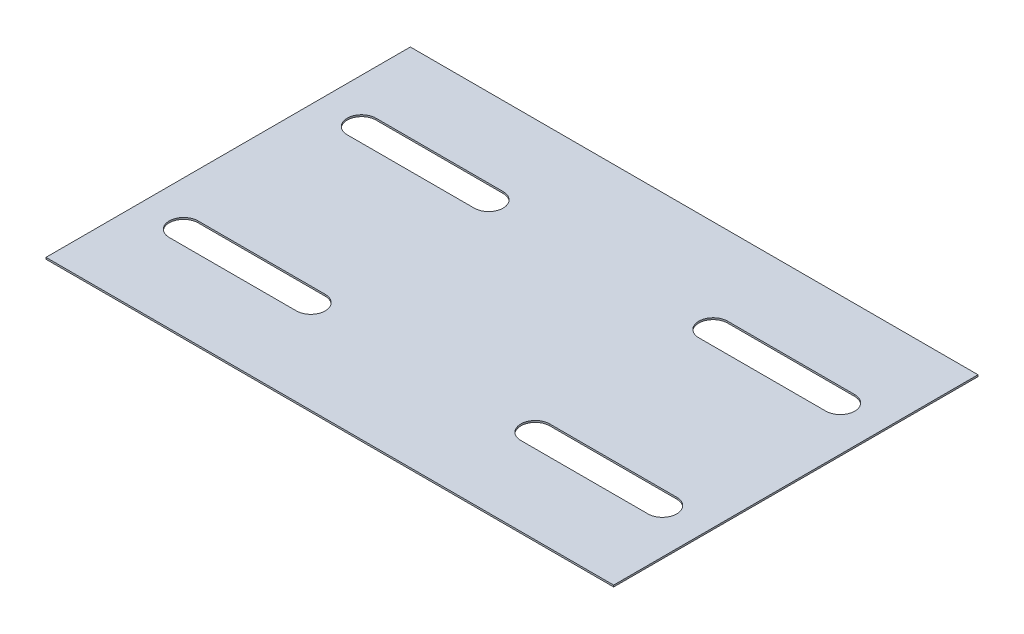
ISO-10303-21;
HEADER;
FILE_DESCRIPTION(('STEP AP214'),'2;1');
FILE_NAME('part.step','',(''),(''),'','','');
FILE_SCHEMA(('AUTOMOTIVE_DESIGN { 1 0 10303 214 1 1 1 1 }'));
ENDSEC;
DATA;
#1=APPLICATION_CONTEXT('core data for automotive mechanical design processes');
#2=APPLICATION_PROTOCOL_DEFINITION('international standard','automotive_design',2000,#1);
#3=PRODUCT_CONTEXT('',#1,'mechanical');
#4=PRODUCT('Part','Part','',(#3));
#5=PRODUCT_RELATED_PRODUCT_CATEGORY('part','',(#4));
#6=PRODUCT_DEFINITION_FORMATION('','',#4);
#7=PRODUCT_DEFINITION_CONTEXT('part definition',#1,'design');
#8=PRODUCT_DEFINITION('design','',#6,#7);
#9=PRODUCT_DEFINITION_SHAPE('','',#8);
#10=(LENGTH_UNIT() NAMED_UNIT(*) SI_UNIT(.MILLI.,.METRE.));
#11=(NAMED_UNIT(*) PLANE_ANGLE_UNIT() SI_UNIT($,.RADIAN.));
#12=(NAMED_UNIT(*) SI_UNIT($,.STERADIAN.) SOLID_ANGLE_UNIT());
#13=UNCERTAINTY_MEASURE_WITH_UNIT(LENGTH_MEASURE(1.E-05),#10,'distance_accuracy_value','');
#14=(GEOMETRIC_REPRESENTATION_CONTEXT(3) GLOBAL_UNCERTAINTY_ASSIGNED_CONTEXT((#13)) GLOBAL_UNIT_ASSIGNED_CONTEXT((#10,
#11,#12)) REPRESENTATION_CONTEXT('',''));
#15=CARTESIAN_POINT('',(0.,0.,0.));
#16=DIRECTION('',(0.,0.,1.));
#17=DIRECTION('',(1.,0.,0.));
#18=AXIS2_PLACEMENT_3D('',#15,#16,#17);
#19=CARTESIAN_POINT('',(28.25,0.2,10.5));
#20=DIRECTION('',(0.,-1.,0.));
#21=DIRECTION('',(0.,0.,-1.));
#22=AXIS2_PLACEMENT_3D('',#19,#20,#21);
#23=CYLINDRICAL_SURFACE('',#22,1.7);
#24=DIRECTION('',(0.,1.,0.));
#25=VECTOR('',#24,1.);
#26=CARTESIAN_POINT('',(28.25,0.2,8.8));
#27=LINE('',#26,#25);
#28=CARTESIAN_POINT('',(28.25,0.,8.8));
#29=VERTEX_POINT('',#28);
#30=CARTESIAN_POINT('',(28.25,0.2,8.8));
#31=VERTEX_POINT('',#30);
#32=EDGE_CURVE('E11',#29,#31,#27,.T.);
#33=ORIENTED_EDGE('',*,*,#32,.F.);
#34=CARTESIAN_POINT('',(28.25,0.,10.5));
#35=DIRECTION('',(0.,1.,0.));
#36=DIRECTION('',(0.,0.,1.));
#37=AXIS2_PLACEMENT_3D('',#34,#35,#36);
#38=CIRCLE('',#37,1.7);
#39=CARTESIAN_POINT('',(28.25,0.,12.2));
#40=VERTEX_POINT('',#39);
#41=EDGE_CURVE('E156',#40,#29,#38,.T.);
#42=ORIENTED_EDGE('',*,*,#41,.F.);
#43=DIRECTION('',(0.,1.,0.));
#44=VECTOR('',#43,1.);
#45=CARTESIAN_POINT('',(28.25,0.2,12.2));
#46=LINE('',#45,#44);
#47=CARTESIAN_POINT('',(28.25,0.2,12.2));
#48=VERTEX_POINT('',#47);
#49=EDGE_CURVE('E62',#40,#48,#46,.T.);
#50=ORIENTED_EDGE('',*,*,#49,.T.);
#51=CARTESIAN_POINT('',(28.25,0.2,10.5));
#52=DIRECTION('',(0.,1.,0.));
#53=DIRECTION('',(0.,0.,-1.));
#54=AXIS2_PLACEMENT_3D('',#51,#52,#53);
#55=CIRCLE('',#54,1.7);
#56=EDGE_CURVE('E250',#48,#31,#55,.T.);
#57=ORIENTED_EDGE('',*,*,#56,.T.);
#58=EDGE_LOOP('',(#33,#42,#50,#57));
#59=FACE_BOUND('',#58,.T.);
#60=ADVANCED_FACE('F51',(#59),#23,.F.);
#61=CARTESIAN_POINT('',(13.25,0.2,12.2));
#62=DIRECTION('',(0.,0.,-1.));
#63=DIRECTION('',(1.,0.,0.));
#64=AXIS2_PLACEMENT_3D('',#61,#62,#63);
#65=PLANE('',#64);
#66=ORIENTED_EDGE('',*,*,#49,.F.);
#67=DIRECTION('',(1.,0.,0.));
#68=VECTOR('',#67,1.);
#69=CARTESIAN_POINT('',(0.,0.,12.2));
#70=LINE('',#69,#68);
#71=CARTESIAN_POINT('',(13.25,0.,12.2));
#72=VERTEX_POINT('',#71);
#73=EDGE_CURVE('E174',#72,#40,#70,.T.);
#74=ORIENTED_EDGE('',*,*,#73,.F.);
#75=DIRECTION('',(0.,1.,0.));
#76=VECTOR('',#75,1.);
#77=CARTESIAN_POINT('',(13.25,0.2,12.2));
#78=LINE('',#77,#76);
#79=CARTESIAN_POINT('',(13.25,0.2,12.2));
#80=VERTEX_POINT('',#79);
#81=EDGE_CURVE('E70',#72,#80,#78,.T.);
#82=ORIENTED_EDGE('',*,*,#81,.T.);
#83=DIRECTION('',(1.,0.,0.));
#84=VECTOR('',#83,1.);
#85=CARTESIAN_POINT('',(13.25,0.2,12.2));
#86=LINE('',#85,#84);
#87=EDGE_CURVE('E196',#80,#48,#86,.T.);
#88=ORIENTED_EDGE('',*,*,#87,.T.);
#89=EDGE_LOOP('',(#66,#74,#82,#88));
#90=FACE_BOUND('',#89,.T.);
#91=ADVANCED_FACE('F256',(#90),#65,.T.);
#92=CARTESIAN_POINT('',(13.25,0.2,10.5));
#93=DIRECTION('',(0.,-1.,0.));
#94=DIRECTION('',(0.,0.,-1.));
#95=AXIS2_PLACEMENT_3D('',#92,#93,#94);
#96=CYLINDRICAL_SURFACE('',#95,1.7);
#97=ORIENTED_EDGE('',*,*,#81,.F.);
#98=CARTESIAN_POINT('',(13.25,0.,10.5));
#99=DIRECTION('',(0.,1.,0.));
#100=DIRECTION('',(0.,0.,1.));
#101=AXIS2_PLACEMENT_3D('',#98,#99,#100);
#102=CIRCLE('',#101,1.7);
#103=CARTESIAN_POINT('',(13.25,0.,8.79999999999999));
#104=VERTEX_POINT('',#103);
#105=EDGE_CURVE('E155',#104,#72,#102,.T.);
#106=ORIENTED_EDGE('',*,*,#105,.F.);
#107=DIRECTION('',(0.,1.,0.));
#108=VECTOR('',#107,1.);
#109=CARTESIAN_POINT('',(13.25,0.2,8.79999999999999));
#110=LINE('',#109,#108);
#111=CARTESIAN_POINT('',(13.25,0.2,8.79999999999999));
#112=VERTEX_POINT('',#111);
#113=EDGE_CURVE('E55',#104,#112,#110,.T.);
#114=ORIENTED_EDGE('',*,*,#113,.T.);
#115=CARTESIAN_POINT('',(13.25,0.2,10.5));
#116=DIRECTION('',(0.,1.,0.));
#117=DIRECTION('',(0.,0.,-1.));
#118=AXIS2_PLACEMENT_3D('',#115,#116,#117);
#119=CIRCLE('',#118,1.7);
#120=EDGE_CURVE('E437',#112,#80,#119,.T.);
#121=ORIENTED_EDGE('',*,*,#120,.T.);
#122=EDGE_LOOP('',(#97,#106,#114,#121));
#123=FACE_BOUND('',#122,.T.);
#124=ADVANCED_FACE('F159',(#123),#96,.F.);
#125=CARTESIAN_POINT('',(-28.25,0.2,-10.5));
#126=DIRECTION('',(0.,-1.,0.));
#127=DIRECTION('',(0.,0.,-1.));
#128=AXIS2_PLACEMENT_3D('',#125,#126,#127);
#129=CYLINDRICAL_SURFACE('',#128,1.7);
#130=DIRECTION('',(0.,1.,0.));
#131=VECTOR('',#130,1.);
#132=CARTESIAN_POINT('',(-28.25,0.2,-8.8));
#133=LINE('',#132,#131);
#134=CARTESIAN_POINT('',(-28.25,0.,-8.8));
#135=VERTEX_POINT('',#134);
#136=CARTESIAN_POINT('',(-28.25,0.2,-8.8));
#137=VERTEX_POINT('',#136);
#138=EDGE_CURVE('E150',#135,#137,#133,.T.);
#139=ORIENTED_EDGE('',*,*,#138,.F.);
#140=CARTESIAN_POINT('',(-28.25,0.,-10.5));
#141=DIRECTION('',(0.,1.,0.));
#142=DIRECTION('',(0.,0.,1.));
#143=AXIS2_PLACEMENT_3D('',#140,#141,#142);
#144=CIRCLE('',#143,1.7);
#145=CARTESIAN_POINT('',(-28.25,0.,-12.2));
#146=VERTEX_POINT('',#145);
#147=EDGE_CURVE('E168',#146,#135,#144,.T.);
#148=ORIENTED_EDGE('',*,*,#147,.F.);
#149=DIRECTION('',(0.,1.,0.));
#150=VECTOR('',#149,1.);
#151=CARTESIAN_POINT('',(-28.25,0.2,-12.2));
#152=LINE('',#151,#150);
#153=CARTESIAN_POINT('',(-28.25,0.2,-12.2));
#154=VERTEX_POINT('',#153);
#155=EDGE_CURVE('E233',#146,#154,#152,.T.);
#156=ORIENTED_EDGE('',*,*,#155,.T.);
#157=CARTESIAN_POINT('',(-28.25,0.2,-10.5));
#158=DIRECTION('',(0.,1.,0.));
#159=DIRECTION('',(0.,0.,-1.));
#160=AXIS2_PLACEMENT_3D('',#157,#158,#159);
#161=CIRCLE('',#160,1.7);
#162=EDGE_CURVE('E431',#154,#137,#161,.T.);
#163=ORIENTED_EDGE('',*,*,#162,.T.);
#164=EDGE_LOOP('',(#139,#148,#156,#163));
#165=FACE_BOUND('',#164,.T.);
#166=ADVANCED_FACE('F496',(#165),#129,.F.);
#167=CARTESIAN_POINT('',(-13.25,0.2,-12.2));
#168=DIRECTION('',(0.,0.,1.));
#169=DIRECTION('',(-1.,0.,0.));
#170=AXIS2_PLACEMENT_3D('',#167,#168,#169);
#171=PLANE('',#170);
#172=ORIENTED_EDGE('',*,*,#155,.F.);
#173=DIRECTION('',(1.,0.,0.));
#174=VECTOR('',#173,1.);
#175=CARTESIAN_POINT('',(0.,0.,-12.2));
#176=LINE('',#175,#174);
#177=CARTESIAN_POINT('',(-13.25,0.,-12.2));
#178=VERTEX_POINT('',#177);
#179=EDGE_CURVE('E161',#178,#146,#176,.F.);
#180=ORIENTED_EDGE('',*,*,#179,.F.);
#181=DIRECTION('',(0.,1.,0.));
#182=VECTOR('',#181,1.);
#183=CARTESIAN_POINT('',(-13.25,0.2,-12.2));
#184=LINE('',#183,#182);
#185=CARTESIAN_POINT('',(-13.25,0.2,-12.2));
#186=VERTEX_POINT('',#185);
#187=EDGE_CURVE('E229',#178,#186,#184,.T.);
#188=ORIENTED_EDGE('',*,*,#187,.T.);
#189=DIRECTION('',(-1.,0.,0.));
#190=VECTOR('',#189,1.);
#191=CARTESIAN_POINT('',(-13.25,0.2,-12.2));
#192=LINE('',#191,#190);
#193=EDGE_CURVE('E337',#186,#154,#192,.T.);
#194=ORIENTED_EDGE('',*,*,#193,.T.);
#195=EDGE_LOOP('',(#172,#180,#188,#194));
#196=FACE_BOUND('',#195,.T.);
#197=ADVANCED_FACE('F335',(#196),#171,.T.);
#198=CARTESIAN_POINT('',(-13.25,0.2,-10.5));
#199=DIRECTION('',(0.,-1.,0.));
#200=DIRECTION('',(0.,0.,-1.));
#201=AXIS2_PLACEMENT_3D('',#198,#199,#200);
#202=CYLINDRICAL_SURFACE('',#201,1.7);
#203=ORIENTED_EDGE('',*,*,#187,.F.);
#204=CARTESIAN_POINT('',(-13.25,0.,-10.5));
#205=DIRECTION('',(0.,1.,0.));
#206=DIRECTION('',(0.,0.,1.));
#207=AXIS2_PLACEMENT_3D('',#204,#205,#206);
#208=CIRCLE('',#207,1.7);
#209=CARTESIAN_POINT('',(-13.25,0.,-8.8));
#210=VERTEX_POINT('',#209);
#211=EDGE_CURVE('E303',#210,#178,#208,.T.);
#212=ORIENTED_EDGE('',*,*,#211,.F.);
#213=DIRECTION('',(0.,1.,0.));
#214=VECTOR('',#213,1.);
#215=CARTESIAN_POINT('',(-13.25,0.2,-8.8));
#216=LINE('',#215,#214);
#217=CARTESIAN_POINT('',(-13.25,0.2,-8.8));
#218=VERTEX_POINT('',#217);
#219=EDGE_CURVE('E225',#210,#218,#216,.T.);
#220=ORIENTED_EDGE('',*,*,#219,.T.);
#221=CARTESIAN_POINT('',(-13.25,0.2,-10.5));
#222=DIRECTION('',(0.,1.,0.));
#223=DIRECTION('',(0.,0.,-1.));
#224=AXIS2_PLACEMENT_3D('',#221,#222,#223);
#225=CIRCLE('',#224,1.7);
#226=EDGE_CURVE('E331',#218,#186,#225,.T.);
#227=ORIENTED_EDGE('',*,*,#226,.T.);
#228=EDGE_LOOP('',(#203,#212,#220,#227));
#229=FACE_BOUND('',#228,.T.);
#230=ADVANCED_FACE('F326',(#229),#202,.F.);
#231=CARTESIAN_POINT('',(-33.5,0.2,21.5));
#232=DIRECTION('',(1.,0.,0.));
#233=DIRECTION('',(0.,0.,1.));
#234=AXIS2_PLACEMENT_3D('',#231,#232,#233);
#235=PLANE('',#234);
#236=DIRECTION('',(0.,1.,0.));
#237=VECTOR('',#236,1.);
#238=CARTESIAN_POINT('',(-33.5,0.2,-21.5));
#239=LINE('',#238,#237);
#240=CARTESIAN_POINT('',(-33.5,0.,-21.5));
#241=VERTEX_POINT('',#240);
#242=CARTESIAN_POINT('',(-33.5,0.2,-21.5));
#243=VERTEX_POINT('',#242);
#244=EDGE_CURVE('E221',#241,#243,#239,.T.);
#245=ORIENTED_EDGE('',*,*,#244,.F.);
#246=DIRECTION('',(0.,0.,-1.));
#247=VECTOR('',#246,1.);
#248=CARTESIAN_POINT('',(-33.5,0.,0.));
#249=LINE('',#248,#247);
#250=CARTESIAN_POINT('',(-33.5,0.,21.5));
#251=VERTEX_POINT('',#250);
#252=EDGE_CURVE('E304',#241,#251,#249,.F.);
#253=ORIENTED_EDGE('',*,*,#252,.T.);
#254=DIRECTION('',(0.,1.,0.));
#255=VECTOR('',#254,1.);
#256=CARTESIAN_POINT('',(-33.5,0.2,21.5));
#257=LINE('',#256,#255);
#258=CARTESIAN_POINT('',(-33.5,0.2,21.5));
#259=VERTEX_POINT('',#258);
#260=EDGE_CURVE('E217',#251,#259,#257,.T.);
#261=ORIENTED_EDGE('',*,*,#260,.T.);
#262=DIRECTION('',(0.,0.,1.));
#263=VECTOR('',#262,1.);
#264=CARTESIAN_POINT('',(-33.5,0.2,21.5));
#265=LINE('',#264,#263);
#266=EDGE_CURVE('E419',#243,#259,#265,.T.);
#267=ORIENTED_EDGE('',*,*,#266,.F.);
#268=EDGE_LOOP('',(#245,#253,#261,#267));
#269=FACE_BOUND('',#268,.T.);
#270=ADVANCED_FACE('F523',(#269),#235,.F.);
#271=CARTESIAN_POINT('',(-33.5,0.2,21.5));
#272=DIRECTION('',(0.,0.,-1.));
#273=DIRECTION('',(1.,0.,0.));
#274=AXIS2_PLACEMENT_3D('',#271,#272,#273);
#275=PLANE('',#274);
#276=ORIENTED_EDGE('',*,*,#260,.F.);
#277=DIRECTION('',(1.,0.,0.));
#278=VECTOR('',#277,1.);
#279=CARTESIAN_POINT('',(0.,0.,21.5));
#280=LINE('',#279,#278);
#281=CARTESIAN_POINT('',(33.5,0.,21.5));
#282=VERTEX_POINT('',#281);
#283=EDGE_CURVE('E299',#251,#282,#280,.T.);
#284=ORIENTED_EDGE('',*,*,#283,.T.);
#285=DIRECTION('',(0.,1.,0.));
#286=VECTOR('',#285,1.);
#287=CARTESIAN_POINT('',(33.5,0.2,21.5));
#288=LINE('',#287,#286);
#289=CARTESIAN_POINT('',(33.5,0.2,21.5));
#290=VERTEX_POINT('',#289);
#291=EDGE_CURVE('E213',#282,#290,#288,.T.);
#292=ORIENTED_EDGE('',*,*,#291,.T.);
#293=DIRECTION('',(1.,0.,0.));
#294=VECTOR('',#293,1.);
#295=CARTESIAN_POINT('',(-33.5,0.2,21.5));
#296=LINE('',#295,#294);
#297=EDGE_CURVE('E423',#259,#290,#296,.T.);
#298=ORIENTED_EDGE('',*,*,#297,.F.);
#299=EDGE_LOOP('',(#276,#284,#292,#298));
#300=FACE_BOUND('',#299,.T.);
#301=ADVANCED_FACE('F527',(#300),#275,.F.);
#302=CARTESIAN_POINT('',(33.5,0.2,21.5));
#303=DIRECTION('',(-1.,0.,0.));
#304=DIRECTION('',(0.,0.,-1.));
#305=AXIS2_PLACEMENT_3D('',#302,#303,#304);
#306=PLANE('',#305);
#307=ORIENTED_EDGE('',*,*,#291,.F.);
#308=DIRECTION('',(0.,0.,-1.));
#309=VECTOR('',#308,1.);
#310=CARTESIAN_POINT('',(33.5,0.,0.));
#311=LINE('',#310,#309);
#312=CARTESIAN_POINT('',(33.5,0.,-21.5));
#313=VERTEX_POINT('',#312);
#314=EDGE_CURVE('E287',#282,#313,#311,.T.);
#315=ORIENTED_EDGE('',*,*,#314,.T.);
#316=DIRECTION('',(0.,1.,0.));
#317=VECTOR('',#316,1.);
#318=CARTESIAN_POINT('',(33.5,0.2,-21.5));
#319=LINE('',#318,#317);
#320=CARTESIAN_POINT('',(33.5,0.2,-21.5));
#321=VERTEX_POINT('',#320);
#322=EDGE_CURVE('E209',#313,#321,#319,.T.);
#323=ORIENTED_EDGE('',*,*,#322,.T.);
#324=DIRECTION('',(0.,0.,-1.));
#325=VECTOR('',#324,1.);
#326=CARTESIAN_POINT('',(33.5,0.2,21.5));
#327=LINE('',#326,#325);
#328=EDGE_CURVE('E412',#290,#321,#327,.T.);
#329=ORIENTED_EDGE('',*,*,#328,.F.);
#330=EDGE_LOOP('',(#307,#315,#323,#329));
#331=FACE_BOUND('',#330,.T.);
#332=ADVANCED_FACE('F531',(#331),#306,.F.);
#333=CARTESIAN_POINT('',(28.25,0.2,-10.5));
#334=DIRECTION('',(0.,-1.,0.));
#335=DIRECTION('',(0.,0.,-1.));
#336=AXIS2_PLACEMENT_3D('',#333,#334,#335);
#337=CYLINDRICAL_SURFACE('',#336,1.7);
#338=DIRECTION('',(0.,1.,0.));
#339=VECTOR('',#338,1.);
#340=CARTESIAN_POINT('',(28.25,0.2,-12.2));
#341=LINE('',#340,#339);
#342=CARTESIAN_POINT('',(28.25,0.,-12.2));
#343=VERTEX_POINT('',#342);
#344=CARTESIAN_POINT('',(28.25,0.2,-12.2));
#345=VERTEX_POINT('',#344);
#346=EDGE_CURVE('E205',#343,#345,#341,.T.);
#347=ORIENTED_EDGE('',*,*,#346,.F.);
#348=CARTESIAN_POINT('',(28.25,0.,-10.5));
#349=DIRECTION('',(0.,1.,0.));
#350=DIRECTION('',(0.,0.,1.));
#351=AXIS2_PLACEMENT_3D('',#348,#349,#350);
#352=CIRCLE('',#351,1.7);
#353=CARTESIAN_POINT('',(28.25,0.,-8.8));
#354=VERTEX_POINT('',#353);
#355=EDGE_CURVE('E288',#354,#343,#352,.T.);
#356=ORIENTED_EDGE('',*,*,#355,.F.);
#357=DIRECTION('',(0.,1.,0.));
#358=VECTOR('',#357,1.);
#359=CARTESIAN_POINT('',(28.25,0.2,-8.8));
#360=LINE('',#359,#358);
#361=CARTESIAN_POINT('',(28.25,0.2,-8.8));
#362=VERTEX_POINT('',#361);
#363=EDGE_CURVE('E201',#354,#362,#360,.T.);
#364=ORIENTED_EDGE('',*,*,#363,.T.);
#365=CARTESIAN_POINT('',(28.25,0.2,-10.5));
#366=DIRECTION('',(0.,1.,0.));
#367=DIRECTION('',(0.,0.,1.));
#368=AXIS2_PLACEMENT_3D('',#365,#366,#367);
#369=CIRCLE('',#368,1.7);
#370=EDGE_CURVE('E404',#362,#345,#369,.T.);
#371=ORIENTED_EDGE('',*,*,#370,.T.);
#372=EDGE_LOOP('',(#347,#356,#364,#371));
#373=FACE_BOUND('',#372,.T.);
#374=ADVANCED_FACE('F535',(#373),#337,.F.);
#375=CARTESIAN_POINT('',(13.25,0.2,-8.8));
#376=DIRECTION('',(0.,0.,-1.));
#377=DIRECTION('',(1.,0.,0.));
#378=AXIS2_PLACEMENT_3D('',#375,#376,#377);
#379=PLANE('',#378);
#380=ORIENTED_EDGE('',*,*,#363,.F.);
#381=DIRECTION('',(1.,0.,0.));
#382=VECTOR('',#381,1.);
#383=CARTESIAN_POINT('',(0.,0.,-8.8));
#384=LINE('',#383,#382);
#385=CARTESIAN_POINT('',(13.25,0.,-8.8));
#386=VERTEX_POINT('',#385);
#387=EDGE_CURVE('E283',#386,#354,#384,.T.);
#388=ORIENTED_EDGE('',*,*,#387,.F.);
#389=DIRECTION('',(0.,1.,0.));
#390=VECTOR('',#389,1.);
#391=CARTESIAN_POINT('',(13.25,0.2,-8.8));
#392=LINE('',#391,#390);
#393=CARTESIAN_POINT('',(13.25,0.2,-8.8));
#394=VERTEX_POINT('',#393);
#395=EDGE_CURVE('E197',#386,#394,#392,.T.);
#396=ORIENTED_EDGE('',*,*,#395,.T.);
#397=DIRECTION('',(1.,0.,0.));
#398=VECTOR('',#397,1.);
#399=CARTESIAN_POINT('',(13.25,0.2,-8.8));
#400=LINE('',#399,#398);
#401=EDGE_CURVE('E408',#394,#362,#400,.T.);
#402=ORIENTED_EDGE('',*,*,#401,.T.);
#403=EDGE_LOOP('',(#380,#388,#396,#402));
#404=FACE_BOUND('',#403,.T.);
#405=ADVANCED_FACE('F542',(#404),#379,.T.);
#406=CARTESIAN_POINT('',(13.25,0.2,-10.5));
#407=DIRECTION('',(0.,-1.,0.));
#408=DIRECTION('',(0.,0.,-1.));
#409=AXIS2_PLACEMENT_3D('',#406,#407,#408);
#410=CYLINDRICAL_SURFACE('',#409,1.7);
#411=ORIENTED_EDGE('',*,*,#395,.F.);
#412=CARTESIAN_POINT('',(13.25,0.,-10.5));
#413=DIRECTION('',(0.,1.,0.));
#414=DIRECTION('',(0.,0.,1.));
#415=AXIS2_PLACEMENT_3D('',#412,#413,#414);
#416=CIRCLE('',#415,1.7);
#417=CARTESIAN_POINT('',(13.25,0.,-12.2));
#418=VERTEX_POINT('',#417);
#419=EDGE_CURVE('E272',#418,#386,#416,.T.);
#420=ORIENTED_EDGE('',*,*,#419,.F.);
#421=DIRECTION('',(0.,1.,0.));
#422=VECTOR('',#421,1.);
#423=CARTESIAN_POINT('',(13.25,0.2,-12.2));
#424=LINE('',#423,#422);
#425=CARTESIAN_POINT('',(13.25,0.2,-12.2));
#426=VERTEX_POINT('',#425);
#427=EDGE_CURVE('E192',#418,#426,#424,.T.);
#428=ORIENTED_EDGE('',*,*,#427,.T.);
#429=CARTESIAN_POINT('',(13.25,0.2,-10.5));
#430=DIRECTION('',(0.,1.,0.));
#431=DIRECTION('',(0.,0.,1.));
#432=AXIS2_PLACEMENT_3D('',#429,#430,#431);
#433=CIRCLE('',#432,1.7);
#434=EDGE_CURVE('E396',#426,#394,#433,.T.);
#435=ORIENTED_EDGE('',*,*,#434,.T.);
#436=EDGE_LOOP('',(#411,#420,#428,#435));
#437=FACE_BOUND('',#436,.T.);
#438=ADVANCED_FACE('F546',(#437),#410,.F.);
#439=CARTESIAN_POINT('',(-28.25,0.2,10.5));
#440=DIRECTION('',(0.,-1.,0.));
#441=DIRECTION('',(0.,0.,-1.));
#442=AXIS2_PLACEMENT_3D('',#439,#440,#441);
#443=CYLINDRICAL_SURFACE('',#442,1.7);
#444=DIRECTION('',(0.,1.,0.));
#445=VECTOR('',#444,1.);
#446=CARTESIAN_POINT('',(-28.25,0.2,12.2));
#447=LINE('',#446,#445);
#448=CARTESIAN_POINT('',(-28.25,0.,12.2));
#449=VERTEX_POINT('',#448);
#450=CARTESIAN_POINT('',(-28.25,0.2,12.2));
#451=VERTEX_POINT('',#450);
#452=EDGE_CURVE('E188',#449,#451,#447,.T.);
#453=ORIENTED_EDGE('',*,*,#452,.F.);
#454=CARTESIAN_POINT('',(-28.25,0.,10.5));
#455=DIRECTION('',(0.,1.,0.));
#456=DIRECTION('',(0.,0.,1.));
#457=AXIS2_PLACEMENT_3D('',#454,#455,#456);
#458=CIRCLE('',#457,1.7);
#459=CARTESIAN_POINT('',(-28.25,0.,8.8));
#460=VERTEX_POINT('',#459);
#461=EDGE_CURVE('E273',#460,#449,#458,.T.);
#462=ORIENTED_EDGE('',*,*,#461,.F.);
#463=DIRECTION('',(0.,1.,0.));
#464=VECTOR('',#463,1.);
#465=CARTESIAN_POINT('',(-28.25,0.2,8.8));
#466=LINE('',#465,#464);
#467=CARTESIAN_POINT('',(-28.25,0.2,8.8));
#468=VERTEX_POINT('',#467);
#469=EDGE_CURVE('E183',#460,#468,#466,.T.);
#470=ORIENTED_EDGE('',*,*,#469,.T.);
#471=CARTESIAN_POINT('',(-28.25,0.2,10.5));
#472=DIRECTION('',(0.,1.,0.));
#473=DIRECTION('',(0.,0.,1.));
#474=AXIS2_PLACEMENT_3D('',#471,#472,#473);
#475=CIRCLE('',#474,1.7);
#476=EDGE_CURVE('E387',#468,#451,#475,.T.);
#477=ORIENTED_EDGE('',*,*,#476,.T.);
#478=EDGE_LOOP('',(#453,#462,#470,#477));
#479=FACE_BOUND('',#478,.T.);
#480=ADVANCED_FACE('F550',(#479),#443,.F.);
#481=CARTESIAN_POINT('',(-13.25,0.2,8.79999999999999));
#482=DIRECTION('',(0.,0.,1.));
#483=DIRECTION('',(-1.,0.,0.));
#484=AXIS2_PLACEMENT_3D('',#481,#482,#483);
#485=PLANE('',#484);
#486=ORIENTED_EDGE('',*,*,#469,.F.);
#487=DIRECTION('',(1.,0.,0.));
#488=VECTOR('',#487,1.);
#489=CARTESIAN_POINT('',(0.,0.,8.79999999999999));
#490=LINE('',#489,#488);
#491=CARTESIAN_POINT('',(-13.25,0.,8.79999999999999));
#492=VERTEX_POINT('',#491);
#493=EDGE_CURVE('E268',#492,#460,#490,.F.);
#494=ORIENTED_EDGE('',*,*,#493,.F.);
#495=DIRECTION('',(0.,1.,0.));
#496=VECTOR('',#495,1.);
#497=CARTESIAN_POINT('',(-13.25,0.2,8.79999999999999));
#498=LINE('',#497,#496);
#499=CARTESIAN_POINT('',(-13.25,0.2,8.79999999999999));
#500=VERTEX_POINT('',#499);
#501=EDGE_CURVE('E179',#492,#500,#498,.T.);
#502=ORIENTED_EDGE('',*,*,#501,.T.);
#503=DIRECTION('',(-1.,0.,0.));
#504=VECTOR('',#503,1.);
#505=CARTESIAN_POINT('',(-13.25,0.2,8.79999999999999));
#506=LINE('',#505,#504);
#507=EDGE_CURVE('E383',#500,#468,#506,.T.);
#508=ORIENTED_EDGE('',*,*,#507,.T.);
#509=EDGE_LOOP('',(#486,#494,#502,#508));
#510=FACE_BOUND('',#509,.T.);
#511=ADVANCED_FACE('F556',(#510),#485,.T.);
#512=CARTESIAN_POINT('',(-13.25,0.2,10.5));
#513=DIRECTION('',(0.,-1.,0.));
#514=DIRECTION('',(0.,0.,-1.));
#515=AXIS2_PLACEMENT_3D('',#512,#513,#514);
#516=CYLINDRICAL_SURFACE('',#515,1.7);
#517=ORIENTED_EDGE('',*,*,#501,.F.);
#518=CARTESIAN_POINT('',(-13.25,0.,10.5));
#519=DIRECTION('',(0.,1.,0.));
#520=DIRECTION('',(0.,0.,1.));
#521=AXIS2_PLACEMENT_3D('',#518,#519,#520);
#522=CIRCLE('',#521,1.7);
#523=CARTESIAN_POINT('',(-13.25,0.,12.2));
#524=VERTEX_POINT('',#523);
#525=EDGE_CURVE('E263',#524,#492,#522,.T.);
#526=ORIENTED_EDGE('',*,*,#525,.F.);
#527=DIRECTION('',(0.,1.,0.));
#528=VECTOR('',#527,1.);
#529=CARTESIAN_POINT('',(-13.25,0.2,12.2));
#530=LINE('',#529,#528);
#531=CARTESIAN_POINT('',(-13.25,0.2,12.2));
#532=VERTEX_POINT('',#531);
#533=EDGE_CURVE('E184',#524,#532,#530,.T.);
#534=ORIENTED_EDGE('',*,*,#533,.T.);
#535=CARTESIAN_POINT('',(-13.25,0.2,10.5));
#536=DIRECTION('',(0.,1.,0.));
#537=DIRECTION('',(0.,0.,1.));
#538=AXIS2_PLACEMENT_3D('',#535,#536,#537);
#539=CIRCLE('',#538,1.7);
#540=EDGE_CURVE('E177',#532,#500,#539,.T.);
#541=ORIENTED_EDGE('',*,*,#540,.T.);
#542=EDGE_LOOP('',(#517,#526,#534,#541));
#543=FACE_BOUND('',#542,.T.);
#544=ADVANCED_FACE('F371',(#543),#516,.F.);
#545=CARTESIAN_POINT('',(-13.25,0.2,12.2));
#546=DIRECTION('',(0.,0.,-1.));
#547=DIRECTION('',(1.,0.,0.));
#548=AXIS2_PLACEMENT_3D('',#545,#546,#547);
#549=PLANE('',#548);
#550=DIRECTION('',(1.,0.,0.));
#551=VECTOR('',#550,1.);
#552=CARTESIAN_POINT('',(0.,0.,12.2));
#553=LINE('',#552,#551);
#554=EDGE_CURVE('E267',#449,#524,#553,.T.);
#555=ORIENTED_EDGE('',*,*,#554,.F.);
#556=ORIENTED_EDGE('',*,*,#452,.T.);
#557=DIRECTION('',(1.,0.,0.));
#558=VECTOR('',#557,1.);
#559=CARTESIAN_POINT('',(-13.25,0.2,12.2));
#560=LINE('',#559,#558);
#561=EDGE_CURVE('E380',#451,#532,#560,.T.);
#562=ORIENTED_EDGE('',*,*,#561,.T.);
#563=ORIENTED_EDGE('',*,*,#533,.F.);
#564=EDGE_LOOP('',(#555,#556,#562,#563));
#565=FACE_BOUND('',#564,.T.);
#566=ADVANCED_FACE('F386',(#565),#549,.T.);
#567=CARTESIAN_POINT('',(13.25,0.2,-12.2));
#568=DIRECTION('',(0.,0.,1.));
#569=DIRECTION('',(-1.,0.,0.));
#570=AXIS2_PLACEMENT_3D('',#567,#568,#569);
#571=PLANE('',#570);
#572=DIRECTION('',(1.,0.,0.));
#573=VECTOR('',#572,1.);
#574=CARTESIAN_POINT('',(0.,0.,-12.2));
#575=LINE('',#574,#573);
#576=EDGE_CURVE('E282',#343,#418,#575,.F.);
#577=ORIENTED_EDGE('',*,*,#576,.F.);
#578=ORIENTED_EDGE('',*,*,#346,.T.);
#579=DIRECTION('',(-1.,0.,0.));
#580=VECTOR('',#579,1.);
#581=CARTESIAN_POINT('',(13.25,0.2,-12.2));
#582=LINE('',#581,#580);
#583=EDGE_CURVE('E400',#345,#426,#582,.T.);
#584=ORIENTED_EDGE('',*,*,#583,.T.);
#585=ORIENTED_EDGE('',*,*,#427,.F.);
#586=EDGE_LOOP('',(#577,#578,#584,#585));
#587=FACE_BOUND('',#586,.T.);
#588=ADVANCED_FACE('F506',(#587),#571,.T.);
#589=CARTESIAN_POINT('',(-33.5,0.2,-21.5));
#590=DIRECTION('',(0.,0.,1.));
#591=DIRECTION('',(-1.,0.,0.));
#592=AXIS2_PLACEMENT_3D('',#589,#590,#591);
#593=PLANE('',#592);
#594=DIRECTION('',(1.,0.,0.));
#595=VECTOR('',#594,1.);
#596=CARTESIAN_POINT('',(0.,0.,-21.5));
#597=LINE('',#596,#595);
#598=EDGE_CURVE('E298',#313,#241,#597,.F.);
#599=ORIENTED_EDGE('',*,*,#598,.T.);
#600=ORIENTED_EDGE('',*,*,#244,.T.);
#601=DIRECTION('',(-1.,0.,0.));
#602=VECTOR('',#601,1.);
#603=CARTESIAN_POINT('',(-33.5,0.2,-21.5));
#604=LINE('',#603,#602);
#605=EDGE_CURVE('E416',#321,#243,#604,.T.);
#606=ORIENTED_EDGE('',*,*,#605,.F.);
#607=ORIENTED_EDGE('',*,*,#322,.F.);
#608=EDGE_LOOP('',(#599,#600,#606,#607));
#609=FACE_BOUND('',#608,.T.);
#610=ADVANCED_FACE('F501',(#609),#593,.F.);
#611=CARTESIAN_POINT('',(-13.25,0.2,-8.8));
#612=DIRECTION('',(0.,0.,-1.));
#613=DIRECTION('',(1.,0.,0.));
#614=AXIS2_PLACEMENT_3D('',#611,#612,#613);
#615=PLANE('',#614);
#616=DIRECTION('',(1.,0.,0.));
#617=VECTOR('',#616,1.);
#618=CARTESIAN_POINT('',(0.,0.,-8.8));
#619=LINE('',#618,#617);
#620=EDGE_CURVE('E172',#135,#210,#619,.T.);
#621=ORIENTED_EDGE('',*,*,#620,.F.);
#622=ORIENTED_EDGE('',*,*,#138,.T.);
#623=DIRECTION('',(1.,0.,0.));
#624=VECTOR('',#623,1.);
#625=CARTESIAN_POINT('',(-13.25,0.2,-8.8));
#626=LINE('',#625,#624);
#627=EDGE_CURVE('E427',#137,#218,#626,.T.);
#628=ORIENTED_EDGE('',*,*,#627,.T.);
#629=ORIENTED_EDGE('',*,*,#219,.F.);
#630=EDGE_LOOP('',(#621,#622,#628,#629));
#631=FACE_BOUND('',#630,.T.);
#632=ADVANCED_FACE('F499',(#631),#615,.T.);
#633=CARTESIAN_POINT('',(13.25,0.2,8.79999999999999));
#634=DIRECTION('',(0.,0.,1.));
#635=DIRECTION('',(-1.,0.,0.));
#636=AXIS2_PLACEMENT_3D('',#633,#634,#635);
#637=PLANE('',#636);
#638=DIRECTION('',(1.,0.,0.));
#639=VECTOR('',#638,1.);
#640=CARTESIAN_POINT('',(0.,0.,8.8));
#641=LINE('',#640,#639);
#642=EDGE_CURVE('E142',#29,#104,#641,.F.);
#643=ORIENTED_EDGE('',*,*,#642,.F.);
#644=ORIENTED_EDGE('',*,*,#32,.T.);
#645=DIRECTION('',(-1.,0.,0.));
#646=VECTOR('',#645,1.);
#647=CARTESIAN_POINT('',(13.25,0.2,8.79999999999999));
#648=LINE('',#647,#646);
#649=EDGE_CURVE('E145',#31,#112,#648,.T.);
#650=ORIENTED_EDGE('',*,*,#649,.T.);
#651=ORIENTED_EDGE('',*,*,#113,.F.);
#652=EDGE_LOOP('',(#643,#644,#650,#651));
#653=FACE_BOUND('',#652,.T.);
#654=ADVANCED_FACE('F53',(#653),#637,.T.);
#655=CARTESIAN_POINT('',(0.,0.2,0.));
#656=DIRECTION('',(0.,-1.,0.));
#657=DIRECTION('',(0.,0.,-1.));
#658=AXIS2_PLACEMENT_3D('',#655,#656,#657);
#659=PLANE('',#658);
#660=ORIENTED_EDGE('',*,*,#540,.F.);
#661=ORIENTED_EDGE('',*,*,#561,.F.);
#662=ORIENTED_EDGE('',*,*,#476,.F.);
#663=ORIENTED_EDGE('',*,*,#507,.F.);
#664=EDGE_LOOP('',(#660,#661,#662,#663));
#665=FACE_BOUND('',#664,.T.);
#666=ORIENTED_EDGE('',*,*,#434,.F.);
#667=ORIENTED_EDGE('',*,*,#583,.F.);
#668=ORIENTED_EDGE('',*,*,#370,.F.);
#669=ORIENTED_EDGE('',*,*,#401,.F.);
#670=EDGE_LOOP('',(#666,#667,#668,#669));
#671=FACE_BOUND('',#670,.T.);
#672=ORIENTED_EDGE('',*,*,#328,.T.);
#673=ORIENTED_EDGE('',*,*,#605,.T.);
#674=ORIENTED_EDGE('',*,*,#266,.T.);
#675=ORIENTED_EDGE('',*,*,#297,.T.);
#676=EDGE_LOOP('',(#672,#673,#674,#675));
#677=FACE_BOUND('',#676,.T.);
#678=ORIENTED_EDGE('',*,*,#226,.F.);
#679=ORIENTED_EDGE('',*,*,#627,.F.);
#680=ORIENTED_EDGE('',*,*,#162,.F.);
#681=ORIENTED_EDGE('',*,*,#193,.F.);
#682=EDGE_LOOP('',(#678,#679,#680,#681));
#683=FACE_BOUND('',#682,.T.);
#684=ORIENTED_EDGE('',*,*,#120,.F.);
#685=ORIENTED_EDGE('',*,*,#649,.F.);
#686=ORIENTED_EDGE('',*,*,#56,.F.);
#687=ORIENTED_EDGE('',*,*,#87,.F.);
#688=EDGE_LOOP('',(#684,#685,#686,#687));
#689=FACE_BOUND('',#688,.T.);
#690=ADVANCED_FACE('F253',(#665,#671,#677,#683,#689),#659,.F.);
#691=CARTESIAN_POINT('',(0.,0.,0.));
#692=DIRECTION('',(0.,-1.,0.));
#693=DIRECTION('',(0.,0.,-1.));
#694=AXIS2_PLACEMENT_3D('',#691,#692,#693);
#695=PLANE('',#694);
#696=ORIENTED_EDGE('',*,*,#525,.T.);
#697=ORIENTED_EDGE('',*,*,#493,.T.);
#698=ORIENTED_EDGE('',*,*,#461,.T.);
#699=ORIENTED_EDGE('',*,*,#554,.T.);
#700=EDGE_LOOP('',(#696,#697,#698,#699));
#701=FACE_BOUND('',#700,.T.);
#702=ORIENTED_EDGE('',*,*,#419,.T.);
#703=ORIENTED_EDGE('',*,*,#387,.T.);
#704=ORIENTED_EDGE('',*,*,#355,.T.);
#705=ORIENTED_EDGE('',*,*,#576,.T.);
#706=EDGE_LOOP('',(#702,#703,#704,#705));
#707=FACE_BOUND('',#706,.T.);
#708=ORIENTED_EDGE('',*,*,#314,.F.);
#709=ORIENTED_EDGE('',*,*,#283,.F.);
#710=ORIENTED_EDGE('',*,*,#252,.F.);
#711=ORIENTED_EDGE('',*,*,#598,.F.);
#712=EDGE_LOOP('',(#708,#709,#710,#711));
#713=FACE_BOUND('',#712,.T.);
#714=ORIENTED_EDGE('',*,*,#211,.T.);
#715=ORIENTED_EDGE('',*,*,#179,.T.);
#716=ORIENTED_EDGE('',*,*,#147,.T.);
#717=ORIENTED_EDGE('',*,*,#620,.T.);
#718=EDGE_LOOP('',(#714,#715,#716,#717));
#719=FACE_BOUND('',#718,.T.);
#720=ORIENTED_EDGE('',*,*,#105,.T.);
#721=ORIENTED_EDGE('',*,*,#73,.T.);
#722=ORIENTED_EDGE('',*,*,#41,.T.);
#723=ORIENTED_EDGE('',*,*,#642,.T.);
#724=EDGE_LOOP('',(#720,#721,#722,#723));
#725=FACE_BOUND('',#724,.T.);
#726=ADVANCED_FACE('F153',(#701,#707,#713,#719,#725),#695,.T.);
#727=CLOSED_SHELL('',(#60,#91,#124,#166,#197,#230,#270,#301,#332,#374,#405,#438,#480,#511,#544,
#566,#588,#610,#632,#654,#690,#726));
#728=MANIFOLD_SOLID_BREP('B2',#727);
#729=ADVANCED_BREP_SHAPE_REPRESENTATION('',(#18,#728),#14);
#730=SHAPE_DEFINITION_REPRESENTATION(#9,#729);
ENDSEC;
END-ISO-10303-21;
